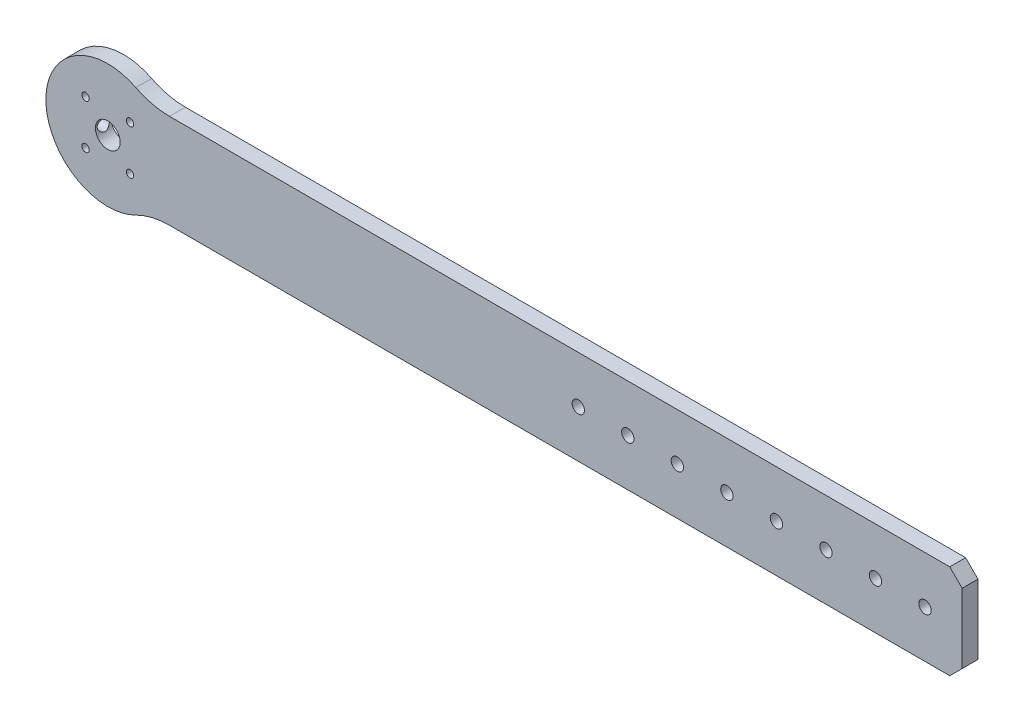
ISO-10303-21;
HEADER;
FILE_DESCRIPTION(('STEP AP214'),'2;1');
FILE_NAME('part.step','',(''),(''),'','','');
FILE_SCHEMA(('AUTOMOTIVE_DESIGN { 1 0 10303 214 1 1 1 1 }'));
ENDSEC;
DATA;
#1=APPLICATION_CONTEXT('core data for automotive mechanical design processes');
#2=APPLICATION_PROTOCOL_DEFINITION('international standard','automotive_design',2000,#1);
#3=PRODUCT_CONTEXT('',#1,'mechanical');
#4=PRODUCT('Part','Part','',(#3));
#5=PRODUCT_RELATED_PRODUCT_CATEGORY('part','',(#4));
#6=PRODUCT_DEFINITION_FORMATION('','',#4);
#7=PRODUCT_DEFINITION_CONTEXT('part definition',#1,'design');
#8=PRODUCT_DEFINITION('design','',#6,#7);
#9=PRODUCT_DEFINITION_SHAPE('','',#8);
#10=(LENGTH_UNIT() NAMED_UNIT(*) SI_UNIT(.MILLI.,.METRE.));
#11=(NAMED_UNIT(*) PLANE_ANGLE_UNIT() SI_UNIT($,.RADIAN.));
#12=(NAMED_UNIT(*) SI_UNIT($,.STERADIAN.) SOLID_ANGLE_UNIT());
#13=UNCERTAINTY_MEASURE_WITH_UNIT(LENGTH_MEASURE(1.E-05),#10,'distance_accuracy_value','');
#14=(GEOMETRIC_REPRESENTATION_CONTEXT(3) GLOBAL_UNCERTAINTY_ASSIGNED_CONTEXT((#13)) GLOBAL_UNIT_ASSIGNED_CONTEXT((#10,
#11,#12)) REPRESENTATION_CONTEXT('',''));
#15=CARTESIAN_POINT('',(0.,0.,0.));
#16=DIRECTION('',(0.,0.,1.));
#17=DIRECTION('',(1.,0.,0.));
#18=AXIS2_PLACEMENT_3D('',#15,#16,#17);
#19=CARTESIAN_POINT('',(0.,0.,3.2));
#20=DIRECTION('',(0.,0.,1.));
#21=DIRECTION('',(1.,0.,0.));
#22=AXIS2_PLACEMENT_3D('',#19,#20,#21);
#23=PLANE('',#22);
#24=CARTESIAN_POINT('',(210.,-8.37955521322352E-13,3.2));
#25=DIRECTION('',(0.,0.,1.));
#26=DIRECTION('',(1.,0.,0.));
#27=AXIS2_PLACEMENT_3D('',#24,#25,#26);
#28=CIRCLE('',#27,2.50000000000002);
#29=CARTESIAN_POINT('',(212.5,-8.37955521322352E-13,3.2));
#30=VERTEX_POINT('',#29);
#31=EDGE_CURVE('E438',#30,#30,#28,.T.);
#32=ORIENTED_EDGE('',*,*,#31,.F.);
#33=EDGE_LOOP('',(#32));
#34=FACE_BOUND('',#33,.T.);
#35=CARTESIAN_POINT('',(250.,-5.58637014214901E-13,3.2));
#36=DIRECTION('',(0.,0.,1.));
#37=DIRECTION('',(1.,0.,0.));
#38=AXIS2_PLACEMENT_3D('',#35,#36,#37);
#39=CIRCLE('',#38,2.50000000000002);
#40=CARTESIAN_POINT('',(252.5,-5.58637014214901E-13,3.2));
#41=VERTEX_POINT('',#40);
#42=EDGE_CURVE('E444',#41,#41,#39,.T.);
#43=ORIENTED_EDGE('',*,*,#42,.F.);
#44=EDGE_LOOP('',(#43));
#45=FACE_BOUND('',#44,.T.);
#46=CARTESIAN_POINT('',(290.,-2.79318507107451E-13,3.2));
#47=DIRECTION('',(0.,0.,1.));
#48=DIRECTION('',(1.,0.,0.));
#49=AXIS2_PLACEMENT_3D('',#46,#47,#48);
#50=CIRCLE('',#49,2.50000000000002);
#51=CARTESIAN_POINT('',(292.5,-2.79318507107451E-13,3.2));
#52=VERTEX_POINT('',#51);
#53=EDGE_CURVE('E356',#52,#52,#50,.T.);
#54=ORIENTED_EDGE('',*,*,#53,.F.);
#55=EDGE_LOOP('',(#54));
#56=FACE_BOUND('',#55,.T.);
#57=CARTESIAN_POINT('',(-8.98025612106908,8.98025612106923,3.2));
#58=DIRECTION('',(0.,0.,1.));
#59=DIRECTION('',(1.,0.,0.));
#60=AXIS2_PLACEMENT_3D('',#57,#58,#59);
#61=CIRCLE('',#60,1.5);
#62=CARTESIAN_POINT('',(-7.48025612106907,8.98025612106923,3.2));
#63=VERTEX_POINT('',#62);
#64=EDGE_CURVE('E371',#63,#63,#61,.T.);
#65=ORIENTED_EDGE('',*,*,#64,.F.);
#66=EDGE_LOOP('',(#65));
#67=FACE_BOUND('',#66,.T.);
#68=CARTESIAN_POINT('',(0.,0.,3.2));
#69=DIRECTION('',(0.,0.,1.));
#70=DIRECTION('',(1.,0.,0.));
#71=AXIS2_PLACEMENT_3D('',#68,#69,#70);
#72=CIRCLE('',#71,5.);
#73=CARTESIAN_POINT('',(5.,0.,3.2));
#74=VERTEX_POINT('',#73);
#75=EDGE_CURVE('E390',#74,#74,#72,.T.);
#76=ORIENTED_EDGE('',*,*,#75,.F.);
#77=EDGE_LOOP('',(#76));
#78=FACE_BOUND('',#77,.T.);
#79=CARTESIAN_POINT('',(8.98025612106914,-8.98025612106917,3.2));
#80=DIRECTION('',(0.,0.,1.));
#81=DIRECTION('',(1.,0.,0.));
#82=AXIS2_PLACEMENT_3D('',#79,#80,#81);
#83=CIRCLE('',#82,1.5);
#84=CARTESIAN_POINT('',(10.4802561210691,-8.98025612106917,3.2));
#85=VERTEX_POINT('',#84);
#86=EDGE_CURVE('E302',#85,#85,#83,.T.);
#87=ORIENTED_EDGE('',*,*,#86,.F.);
#88=EDGE_LOOP('',(#87));
#89=FACE_BOUND('',#88,.T.);
#90=DIRECTION('',(1.,0.,0.));
#91=VECTOR('',#90,1.);
#92=CARTESIAN_POINT('',(345.,-19.05,3.2));
#93=LINE('',#92,#91);
#94=CARTESIAN_POINT('',(24.8816699600328,-19.05,3.2));
#95=VERTEX_POINT('',#94);
#96=CARTESIAN_POINT('',(340.,-19.05,3.2));
#97=VERTEX_POINT('',#96);
#98=EDGE_CURVE('E138',#95,#97,#93,.T.);
#99=ORIENTED_EDGE('',*,*,#98,.T.);
#100=DIRECTION('',(-0.707106781186551,-0.707106781186544,0.));
#101=VECTOR('',#100,1.);
#102=CARTESIAN_POINT('',(179.524999999998,-179.525,3.2));
#103=LINE('',#102,#101);
#104=CARTESIAN_POINT('',(345.,-14.05,3.2));
#105=VERTEX_POINT('',#104);
#106=EDGE_CURVE('E62',#97,#105,#103,.F.);
#107=ORIENTED_EDGE('',*,*,#106,.T.);
#108=DIRECTION('',(0.,1.,0.));
#109=VECTOR('',#108,1.);
#110=CARTESIAN_POINT('',(345.,19.05,3.2));
#111=LINE('',#110,#109);
#112=CARTESIAN_POINT('',(345.,14.0499999999999,3.2));
#113=VERTEX_POINT('',#112);
#114=EDGE_CURVE('E147',#105,#113,#111,.T.);
#115=ORIENTED_EDGE('',*,*,#114,.T.);
#116=DIRECTION('',(0.707106781186551,-0.707106781186544,0.));
#117=VECTOR('',#116,1.);
#118=CARTESIAN_POINT('',(179.524999999998,179.525,3.2));
#119=LINE('',#118,#117);
#120=CARTESIAN_POINT('',(340.,19.05,3.2));
#121=VERTEX_POINT('',#120);
#122=EDGE_CURVE('E69',#113,#121,#119,.F.);
#123=ORIENTED_EDGE('',*,*,#122,.T.);
#124=DIRECTION('',(-1.,0.,0.));
#125=VECTOR('',#124,1.);
#126=CARTESIAN_POINT('',(345.,19.05,3.2));
#127=LINE('',#126,#125);
#128=CARTESIAN_POINT('',(24.8816699600328,19.05,3.2));
#129=VERTEX_POINT('',#128);
#130=EDGE_CURVE('E153',#121,#129,#127,.T.);
#131=ORIENTED_EDGE('',*,*,#130,.T.);
#132=CARTESIAN_POINT('',(24.8816699600328,49.05,3.2));
#133=DIRECTION('',(0.,0.,1.));
#134=DIRECTION('',(1.,0.,0.));
#135=AXIS2_PLACEMENT_3D('',#132,#133,#134);
#136=CIRCLE('',#135,30.);
#137=CARTESIAN_POINT('',(11.3098499818331,22.2954545454546,3.2));
#138=VERTEX_POINT('',#137);
#139=EDGE_CURVE('E173',#129,#138,#136,.F.);
#140=ORIENTED_EDGE('',*,*,#139,.T.);
#141=CARTESIAN_POINT('',(0.,0.,3.2));
#142=DIRECTION('',(0.,0.,1.));
#143=DIRECTION('',(1.,0.,0.));
#144=AXIS2_PLACEMENT_3D('',#141,#142,#143);
#145=CIRCLE('',#144,25.);
#146=CARTESIAN_POINT('',(11.3098499818331,-22.2954545454546,3.2));
#147=VERTEX_POINT('',#146);
#148=EDGE_CURVE('E331',#138,#147,#145,.T.);
#149=ORIENTED_EDGE('',*,*,#148,.T.);
#150=CARTESIAN_POINT('',(24.8816699600328,-49.05,3.2));
#151=DIRECTION('',(0.,0.,1.));
#152=DIRECTION('',(1.,0.,0.));
#153=AXIS2_PLACEMENT_3D('',#150,#151,#152);
#154=CIRCLE('',#153,30.);
#155=EDGE_CURVE('E133',#147,#95,#154,.F.);
#156=ORIENTED_EDGE('',*,*,#155,.T.);
#157=EDGE_LOOP('',(#99,#107,#115,#123,#131,#140,#149,#156));
#158=FACE_BOUND('',#157,.T.);
#159=CARTESIAN_POINT('',(8.98025612106914,8.98025612106917,3.2));
#160=DIRECTION('',(0.,0.,1.));
#161=DIRECTION('',(1.,0.,0.));
#162=AXIS2_PLACEMENT_3D('',#159,#160,#161);
#163=CIRCLE('',#162,1.5);
#164=CARTESIAN_POINT('',(10.4802561210691,8.98025612106917,3.2));
#165=VERTEX_POINT('',#164);
#166=EDGE_CURVE('E321',#165,#165,#163,.T.);
#167=ORIENTED_EDGE('',*,*,#166,.F.);
#168=EDGE_LOOP('',(#167));
#169=FACE_BOUND('',#168,.T.);
#170=CARTESIAN_POINT('',(-8.9802561210692,-8.98025612106911,3.2));
#171=DIRECTION('',(0.,0.,1.));
#172=DIRECTION('',(1.,0.,0.));
#173=AXIS2_PLACEMENT_3D('',#170,#171,#172);
#174=CIRCLE('',#173,1.5);
#175=CARTESIAN_POINT('',(-7.4802561210692,-8.98025612106911,3.2));
#176=VERTEX_POINT('',#175);
#177=EDGE_CURVE('E308',#176,#176,#174,.T.);
#178=ORIENTED_EDGE('',*,*,#177,.F.);
#179=EDGE_LOOP('',(#178));
#180=FACE_BOUND('',#179,.T.);
#181=CARTESIAN_POINT('',(330.,0.,3.2));
#182=DIRECTION('',(0.,0.,1.));
#183=DIRECTION('',(1.,0.,0.));
#184=AXIS2_PLACEMENT_3D('',#181,#182,#183);
#185=CIRCLE('',#184,2.50000000000002);
#186=CARTESIAN_POINT('',(332.5,0.,3.2));
#187=VERTEX_POINT('',#186);
#188=EDGE_CURVE('E382',#187,#187,#185,.T.);
#189=ORIENTED_EDGE('',*,*,#188,.F.);
#190=EDGE_LOOP('',(#189));
#191=FACE_BOUND('',#190,.T.);
#192=CARTESIAN_POINT('',(310.,-1.39659253553725E-13,3.2));
#193=DIRECTION('',(0.,0.,1.));
#194=DIRECTION('',(1.,0.,0.));
#195=AXIS2_PLACEMENT_3D('',#192,#193,#194);
#196=CIRCLE('',#195,2.50000000000002);
#197=CARTESIAN_POINT('',(312.5,-1.39659253553725E-13,3.2));
#198=VERTEX_POINT('',#197);
#199=EDGE_CURVE('E365',#198,#198,#196,.T.);
#200=ORIENTED_EDGE('',*,*,#199,.F.);
#201=EDGE_LOOP('',(#200));
#202=FACE_BOUND('',#201,.T.);
#203=CARTESIAN_POINT('',(270.,-4.18977760661176E-13,3.2));
#204=DIRECTION('',(0.,0.,1.));
#205=DIRECTION('',(1.,0.,0.));
#206=AXIS2_PLACEMENT_3D('',#203,#204,#205);
#207=CIRCLE('',#206,2.50000000000002);
#208=CARTESIAN_POINT('',(272.5,-4.18977760661176E-13,3.2));
#209=VERTEX_POINT('',#208);
#210=EDGE_CURVE('E357',#209,#209,#207,.T.);
#211=ORIENTED_EDGE('',*,*,#210,.F.);
#212=EDGE_LOOP('',(#211));
#213=FACE_BOUND('',#212,.T.);
#214=CARTESIAN_POINT('',(230.,-6.98296267768627E-13,3.2));
#215=DIRECTION('',(0.,0.,1.));
#216=DIRECTION('',(1.,0.,0.));
#217=AXIS2_PLACEMENT_3D('',#214,#215,#216);
#218=CIRCLE('',#217,2.50000000000002);
#219=CARTESIAN_POINT('',(232.5,-6.98296267768627E-13,3.2));
#220=VERTEX_POINT('',#219);
#221=EDGE_CURVE('E359',#220,#220,#218,.T.);
#222=ORIENTED_EDGE('',*,*,#221,.F.);
#223=EDGE_LOOP('',(#222));
#224=FACE_BOUND('',#223,.T.);
#225=CARTESIAN_POINT('',(190.,-9.77614774876077E-13,3.2));
#226=DIRECTION('',(0.,0.,1.));
#227=DIRECTION('',(1.,0.,0.));
#228=AXIS2_PLACEMENT_3D('',#225,#226,#227);
#229=CIRCLE('',#228,2.50000000000002);
#230=CARTESIAN_POINT('',(192.5,-9.77614774876077E-13,3.2));
#231=VERTEX_POINT('',#230);
#232=EDGE_CURVE('E430',#231,#231,#229,.T.);
#233=ORIENTED_EDGE('',*,*,#232,.F.);
#234=EDGE_LOOP('',(#233));
#235=FACE_BOUND('',#234,.T.);
#236=ADVANCED_FACE('F53',(#34,#45,#56,#67,#78,#89,#158,#169,#180,#191,#202,#213,#224,#235),#23,.T.);
#237=CARTESIAN_POINT('',(0.,0.,-3.2));
#238=DIRECTION('',(0.,0.,1.));
#239=DIRECTION('',(1.,0.,0.));
#240=AXIS2_PLACEMENT_3D('',#237,#238,#239);
#241=PLANE('',#240);
#242=DIRECTION('',(0.,1.,0.));
#243=VECTOR('',#242,1.);
#244=CARTESIAN_POINT('',(345.,19.05,-3.2));
#245=LINE('',#244,#243);
#246=CARTESIAN_POINT('',(345.,-14.05,-3.2));
#247=VERTEX_POINT('',#246);
#248=CARTESIAN_POINT('',(345.,14.0499999999999,-3.2));
#249=VERTEX_POINT('',#248);
#250=EDGE_CURVE('E325',#247,#249,#245,.T.);
#251=ORIENTED_EDGE('',*,*,#250,.F.);
#252=DIRECTION('',(0.707106781186551,0.707106781186544,0.));
#253=VECTOR('',#252,1.);
#254=CARTESIAN_POINT('',(345.,-14.0500000000001,-3.2));
#255=LINE('',#254,#253);
#256=CARTESIAN_POINT('',(340.,-19.05,-3.2));
#257=VERTEX_POINT('',#256);
#258=EDGE_CURVE('E145',#247,#257,#255,.F.);
#259=ORIENTED_EDGE('',*,*,#258,.T.);
#260=DIRECTION('',(1.,0.,0.));
#261=VECTOR('',#260,1.);
#262=CARTESIAN_POINT('',(345.,-19.05,-3.2));
#263=LINE('',#262,#261);
#264=CARTESIAN_POINT('',(24.8816699600328,-19.05,-3.2));
#265=VERTEX_POINT('',#264);
#266=EDGE_CURVE('E137',#265,#257,#263,.T.);
#267=ORIENTED_EDGE('',*,*,#266,.F.);
#268=CARTESIAN_POINT('',(24.8816699600328,-49.05,-3.2));
#269=DIRECTION('',(0.,0.,1.));
#270=DIRECTION('',(1.,0.,0.));
#271=AXIS2_PLACEMENT_3D('',#268,#269,#270);
#272=CIRCLE('',#271,30.);
#273=CARTESIAN_POINT('',(11.3098499818331,-22.2954545454546,-3.2));
#274=VERTEX_POINT('',#273);
#275=EDGE_CURVE('E122',#265,#274,#272,.T.);
#276=ORIENTED_EDGE('',*,*,#275,.T.);
#277=CARTESIAN_POINT('',(0.,0.,-3.2));
#278=DIRECTION('',(0.,0.,1.));
#279=DIRECTION('',(1.,0.,0.));
#280=AXIS2_PLACEMENT_3D('',#277,#278,#279);
#281=CIRCLE('',#280,25.);
#282=CARTESIAN_POINT('',(11.3098499818331,22.2954545454546,-3.2));
#283=VERTEX_POINT('',#282);
#284=EDGE_CURVE('E148',#283,#274,#281,.T.);
#285=ORIENTED_EDGE('',*,*,#284,.F.);
#286=CARTESIAN_POINT('',(24.8816699600328,49.05,-3.2));
#287=DIRECTION('',(0.,0.,1.));
#288=DIRECTION('',(1.,0.,0.));
#289=AXIS2_PLACEMENT_3D('',#286,#287,#288);
#290=CIRCLE('',#289,30.);
#291=CARTESIAN_POINT('',(24.8816699600328,19.05,-3.2));
#292=VERTEX_POINT('',#291);
#293=EDGE_CURVE('E170',#283,#292,#290,.T.);
#294=ORIENTED_EDGE('',*,*,#293,.T.);
#295=DIRECTION('',(-1.,0.,0.));
#296=VECTOR('',#295,1.);
#297=CARTESIAN_POINT('',(345.,19.05,-3.2));
#298=LINE('',#297,#296);
#299=CARTESIAN_POINT('',(340.,19.05,-3.2));
#300=VERTEX_POINT('',#299);
#301=EDGE_CURVE('E156',#300,#292,#298,.T.);
#302=ORIENTED_EDGE('',*,*,#301,.F.);
#303=DIRECTION('',(-0.707106781186551,0.707106781186544,0.));
#304=VECTOR('',#303,1.);
#305=CARTESIAN_POINT('',(340.,19.05,-3.2));
#306=LINE('',#305,#304);
#307=EDGE_CURVE('E183',#300,#249,#306,.F.);
#308=ORIENTED_EDGE('',*,*,#307,.T.);
#309=EDGE_LOOP('',(#251,#259,#267,#276,#285,#294,#302,#308));
#310=FACE_BOUND('',#309,.T.);
#311=CARTESIAN_POINT('',(8.98025612106914,8.98025612106917,-3.2));
#312=DIRECTION('',(0.,0.,1.));
#313=DIRECTION('',(1.,0.,0.));
#314=AXIS2_PLACEMENT_3D('',#311,#312,#313);
#315=CIRCLE('',#314,1.5);
#316=CARTESIAN_POINT('',(10.4802561210691,8.98025612106917,-3.2));
#317=VERTEX_POINT('',#316);
#318=EDGE_CURVE('E313',#317,#317,#315,.T.);
#319=ORIENTED_EDGE('',*,*,#318,.T.);
#320=EDGE_LOOP('',(#319));
#321=FACE_BOUND('',#320,.T.);
#322=CARTESIAN_POINT('',(8.98025612106914,-8.98025612106917,-3.2));
#323=DIRECTION('',(0.,0.,1.));
#324=DIRECTION('',(1.,0.,0.));
#325=AXIS2_PLACEMENT_3D('',#322,#323,#324);
#326=CIRCLE('',#325,1.5);
#327=CARTESIAN_POINT('',(10.4802561210691,-8.98025612106917,-3.2));
#328=VERTEX_POINT('',#327);
#329=EDGE_CURVE('E305',#328,#328,#326,.T.);
#330=ORIENTED_EDGE('',*,*,#329,.T.);
#331=EDGE_LOOP('',(#330));
#332=FACE_BOUND('',#331,.T.);
#333=CARTESIAN_POINT('',(-8.9802561210692,-8.98025612106911,-3.2));
#334=DIRECTION('',(0.,0.,1.));
#335=DIRECTION('',(1.,0.,0.));
#336=AXIS2_PLACEMENT_3D('',#333,#334,#335);
#337=CIRCLE('',#336,1.5);
#338=CARTESIAN_POINT('',(-7.4802561210692,-8.98025612106911,-3.2));
#339=VERTEX_POINT('',#338);
#340=EDGE_CURVE('E317',#339,#339,#337,.T.);
#341=ORIENTED_EDGE('',*,*,#340,.T.);
#342=EDGE_LOOP('',(#341));
#343=FACE_BOUND('',#342,.T.);
#344=CARTESIAN_POINT('',(0.,0.,-3.2));
#345=DIRECTION('',(0.,0.,1.));
#346=DIRECTION('',(1.,0.,0.));
#347=AXIS2_PLACEMENT_3D('',#344,#345,#346);
#348=CIRCLE('',#347,5.);
#349=CARTESIAN_POINT('',(5.,0.,-3.2));
#350=VERTEX_POINT('',#349);
#351=EDGE_CURVE('E386',#350,#350,#348,.T.);
#352=ORIENTED_EDGE('',*,*,#351,.T.);
#353=EDGE_LOOP('',(#352));
#354=FACE_BOUND('',#353,.T.);
#355=CARTESIAN_POINT('',(330.,0.,-3.2));
#356=DIRECTION('',(0.,0.,1.));
#357=DIRECTION('',(1.,0.,0.));
#358=AXIS2_PLACEMENT_3D('',#355,#356,#357);
#359=CIRCLE('',#358,2.50000000000002);
#360=CARTESIAN_POINT('',(332.5,0.,-3.2));
#361=VERTEX_POINT('',#360);
#362=EDGE_CURVE('E380',#361,#361,#359,.T.);
#363=ORIENTED_EDGE('',*,*,#362,.T.);
#364=EDGE_LOOP('',(#363));
#365=FACE_BOUND('',#364,.T.);
#366=CARTESIAN_POINT('',(-8.98025612106908,8.98025612106923,-3.2));
#367=DIRECTION('',(0.,0.,1.));
#368=DIRECTION('',(1.,0.,0.));
#369=AXIS2_PLACEMENT_3D('',#366,#367,#368);
#370=CIRCLE('',#369,1.5);
#371=CARTESIAN_POINT('',(-7.48025612106907,8.98025612106923,-3.2));
#372=VERTEX_POINT('',#371);
#373=EDGE_CURVE('E345',#372,#372,#370,.T.);
#374=ORIENTED_EDGE('',*,*,#373,.T.);
#375=EDGE_LOOP('',(#374));
#376=FACE_BOUND('',#375,.T.);
#377=CARTESIAN_POINT('',(310.,-1.39659253553725E-13,-3.2));
#378=DIRECTION('',(0.,0.,1.));
#379=DIRECTION('',(1.,0.,0.));
#380=AXIS2_PLACEMENT_3D('',#377,#378,#379);
#381=CIRCLE('',#380,2.50000000000002);
#382=CARTESIAN_POINT('',(312.5,-1.39659253553725E-13,-3.2));
#383=VERTEX_POINT('',#382);
#384=EDGE_CURVE('E367',#383,#383,#381,.T.);
#385=ORIENTED_EDGE('',*,*,#384,.T.);
#386=EDGE_LOOP('',(#385));
#387=FACE_BOUND('',#386,.T.);
#388=CARTESIAN_POINT('',(290.,-2.79318507107451E-13,-3.2));
#389=DIRECTION('',(0.,0.,1.));
#390=DIRECTION('',(1.,0.,0.));
#391=AXIS2_PLACEMENT_3D('',#388,#389,#390);
#392=CIRCLE('',#391,2.50000000000002);
#393=CARTESIAN_POINT('',(292.5,-2.79318507107451E-13,-3.2));
#394=VERTEX_POINT('',#393);
#395=EDGE_CURVE('E353',#394,#394,#392,.T.);
#396=ORIENTED_EDGE('',*,*,#395,.T.);
#397=EDGE_LOOP('',(#396));
#398=FACE_BOUND('',#397,.T.);
#399=CARTESIAN_POINT('',(270.,-4.18977760661176E-13,-3.2));
#400=DIRECTION('',(0.,0.,1.));
#401=DIRECTION('',(1.,0.,0.));
#402=AXIS2_PLACEMENT_3D('',#399,#400,#401);
#403=CIRCLE('',#402,2.50000000000002);
#404=CARTESIAN_POINT('',(272.5,-4.18977760661176E-13,-3.2));
#405=VERTEX_POINT('',#404);
#406=EDGE_CURVE('E415',#405,#405,#403,.T.);
#407=ORIENTED_EDGE('',*,*,#406,.T.);
#408=EDGE_LOOP('',(#407));
#409=FACE_BOUND('',#408,.T.);
#410=CARTESIAN_POINT('',(250.,-5.58637014214901E-13,-3.2));
#411=DIRECTION('',(0.,0.,1.));
#412=DIRECTION('',(1.,0.,0.));
#413=AXIS2_PLACEMENT_3D('',#410,#411,#412);
#414=CIRCLE('',#413,2.50000000000002);
#415=CARTESIAN_POINT('',(252.5,-5.58637014214901E-13,-3.2));
#416=VERTEX_POINT('',#415);
#417=EDGE_CURVE('E361',#416,#416,#414,.T.);
#418=ORIENTED_EDGE('',*,*,#417,.T.);
#419=EDGE_LOOP('',(#418));
#420=FACE_BOUND('',#419,.T.);
#421=CARTESIAN_POINT('',(230.,-6.98296267768627E-13,-3.2));
#422=DIRECTION('',(0.,0.,1.));
#423=DIRECTION('',(1.,0.,0.));
#424=AXIS2_PLACEMENT_3D('',#421,#422,#423);
#425=CIRCLE('',#424,2.50000000000002);
#426=CARTESIAN_POINT('',(232.5,-6.98296267768627E-13,-3.2));
#427=VERTEX_POINT('',#426);
#428=EDGE_CURVE('E362',#427,#427,#425,.T.);
#429=ORIENTED_EDGE('',*,*,#428,.T.);
#430=EDGE_LOOP('',(#429));
#431=FACE_BOUND('',#430,.T.);
#432=CARTESIAN_POINT('',(210.,-8.37955521322352E-13,-3.2));
#433=DIRECTION('',(0.,0.,1.));
#434=DIRECTION('',(1.,0.,0.));
#435=AXIS2_PLACEMENT_3D('',#432,#433,#434);
#436=CIRCLE('',#435,2.50000000000002);
#437=CARTESIAN_POINT('',(212.5,-8.37955521322352E-13,-3.2));
#438=VERTEX_POINT('',#437);
#439=EDGE_CURVE('E425',#438,#438,#436,.T.);
#440=ORIENTED_EDGE('',*,*,#439,.T.);
#441=EDGE_LOOP('',(#440));
#442=FACE_BOUND('',#441,.T.);
#443=CARTESIAN_POINT('',(190.,-9.77614774876077E-13,-3.2));
#444=DIRECTION('',(0.,0.,1.));
#445=DIRECTION('',(1.,0.,0.));
#446=AXIS2_PLACEMENT_3D('',#443,#444,#445);
#447=CIRCLE('',#446,2.50000000000002);
#448=CARTESIAN_POINT('',(192.5,-9.77614774876077E-13,-3.2));
#449=VERTEX_POINT('',#448);
#450=EDGE_CURVE('E428',#449,#449,#447,.T.);
#451=ORIENTED_EDGE('',*,*,#450,.T.);
#452=EDGE_LOOP('',(#451));
#453=FACE_BOUND('',#452,.T.);
#454=ADVANCED_FACE('F143',(#310,#321,#332,#343,#354,#365,#376,#387,#398,#409,#420,#431,#442,
#453),#241,.F.);
#455=CARTESIAN_POINT('',(345.,19.05,3.2));
#456=DIRECTION('',(-1.,0.,0.));
#457=DIRECTION('',(0.,0.,1.));
#458=AXIS2_PLACEMENT_3D('',#455,#456,#457);
#459=PLANE('',#458);
#460=ORIENTED_EDGE('',*,*,#114,.F.);
#461=DIRECTION('',(0.,0.,-1.));
#462=VECTOR('',#461,1.);
#463=CARTESIAN_POINT('',(345.,-14.0500000000001,3.2));
#464=LINE('',#463,#462);
#465=EDGE_CURVE('E179',#105,#247,#464,.T.);
#466=ORIENTED_EDGE('',*,*,#465,.T.);
#467=ORIENTED_EDGE('',*,*,#250,.T.);
#468=DIRECTION('',(0.,0.,1.));
#469=VECTOR('',#468,1.);
#470=CARTESIAN_POINT('',(345.,14.0499999999999,3.2));
#471=LINE('',#470,#469);
#472=EDGE_CURVE('E176',#249,#113,#471,.T.);
#473=ORIENTED_EDGE('',*,*,#472,.T.);
#474=EDGE_LOOP('',(#460,#466,#467,#473));
#475=FACE_BOUND('',#474,.T.);
#476=ADVANCED_FACE('F199',(#475),#459,.F.);
#477=CARTESIAN_POINT('',(345.,19.05,3.2));
#478=DIRECTION('',(0.,-1.,0.));
#479=DIRECTION('',(1.,0.,0.));
#480=AXIS2_PLACEMENT_3D('',#477,#478,#479);
#481=PLANE('',#480);
#482=ORIENTED_EDGE('',*,*,#130,.F.);
#483=DIRECTION('',(0.,0.,-1.));
#484=VECTOR('',#483,1.);
#485=CARTESIAN_POINT('',(340.,19.05,3.2));
#486=LINE('',#485,#484);
#487=EDGE_CURVE('E13',#121,#300,#486,.T.);
#488=ORIENTED_EDGE('',*,*,#487,.T.);
#489=ORIENTED_EDGE('',*,*,#301,.T.);
#490=DIRECTION('',(0.,0.,1.));
#491=VECTOR('',#490,1.);
#492=CARTESIAN_POINT('',(24.8816699600328,19.05,3.2));
#493=LINE('',#492,#491);
#494=EDGE_CURVE('E134',#292,#129,#493,.T.);
#495=ORIENTED_EDGE('',*,*,#494,.T.);
#496=EDGE_LOOP('',(#482,#488,#489,#495));
#497=FACE_BOUND('',#496,.T.);
#498=ADVANCED_FACE('F231',(#497),#481,.F.);
#499=CARTESIAN_POINT('',(0.,0.,3.2));
#500=DIRECTION('',(0.,0.,-1.));
#501=DIRECTION('',(-1.,0.,0.));
#502=AXIS2_PLACEMENT_3D('',#499,#500,#501);
#503=CYLINDRICAL_SURFACE('',#502,25.);
#504=CARTESIAN_POINT('',(-25.,0.,-2.5));
#505=CARTESIAN_POINT('',(-24.9999983880192,-0.140050884478893,-2.49999393524905));
#506=CARTESIAN_POINT('',(-24.9988106399051,-0.280194362919433,-2.48819182775889));
#507=CARTESIAN_POINT('',(-24.9941866898684,-0.556595996242093,-2.44128907427393));
#508=CARTESIAN_POINT('',(-24.9907480108506,-0.69284969792207,-2.40616275993853));
#509=CARTESIAN_POINT('',(-24.9820103640768,-0.957429188633536,-2.31364439850542));
#510=CARTESIAN_POINT('',(-24.9767125200177,-1.08575971153727,-2.25626579870381));
#511=CARTESIAN_POINT('',(-24.9648489348577,-1.33094040240102,-2.12089773017089));
#512=CARTESIAN_POINT('',(-24.9582834459533,-1.44779284694769,-2.04291235999965));
#513=CARTESIAN_POINT('',(-24.9445936085331,-1.6671488766852,-1.86824325584431));
#514=CARTESIAN_POINT('',(-24.9374675393466,-1.76960536208723,-1.77150050149492));
#515=CARTESIAN_POINT('',(-24.9234739226566,-1.95685630357746,-1.56218866434242));
#516=CARTESIAN_POINT('',(-24.9166063871229,-2.04164994270663,-1.44961884989403));
#517=CARTESIAN_POINT('',(-24.9038897888196,-2.19133492610904,-1.21155367079095));
#518=CARTESIAN_POINT('',(-24.8980429177726,-2.2561836636372,-1.08603138976285));
#519=CARTESIAN_POINT('',(-24.8880509386631,-2.3638659618569,-0.825811035237553));
#520=CARTESIAN_POINT('',(-24.8839057885556,-2.40670006647823,-0.691113188540125));
#521=CARTESIAN_POINT('',(-24.8778021018244,-2.46899760400473,-0.416845497834976));
#522=CARTESIAN_POINT('',(-24.8758362599524,-2.48853913250949,-0.277293557869479));
#523=CARTESIAN_POINT('',(-24.8742910765131,-2.5039382128384,0.00312215848945159));
#524=CARTESIAN_POINT('',(-24.8747116722186,-2.499796387177,0.143985900305148));
#525=CARTESIAN_POINT('',(-24.8778851724734,-2.4680107006317,0.422488274233296));
#526=CARTESIAN_POINT('',(-24.8806296147663,-2.44045211031138,0.560136748321736));
#527=CARTESIAN_POINT('',(-24.8881283571855,-2.36274786037647,0.828844908002736));
#528=CARTESIAN_POINT('',(-24.8928826844623,-2.31260189563937,0.959904504562578));
#529=CARTESIAN_POINT('',(-24.9038752363018,-2.19105223470377,1.21198396824722));
#530=CARTESIAN_POINT('',(-24.9101160977039,-2.11961070679995,1.33298547372329));
#531=CARTESIAN_POINT('',(-24.923376293322,-1.95752506838307,1.56131303727971));
#532=CARTESIAN_POINT('',(-24.9303956503196,-1.86688039584126,1.66863869495441));
#533=CARTESIAN_POINT('',(-24.9444596328247,-1.66848528103017,1.86706348497257));
#534=CARTESIAN_POINT('',(-24.9515042333249,-1.56066119712841,1.95808900470201));
#535=CARTESIAN_POINT('',(-24.964795726963,-1.33122370434278,2.12075908227597));
#536=CARTESIAN_POINT('',(-24.9710426192064,-1.209610279999,2.19240361839119));
#537=CARTESIAN_POINT('',(-24.9820368916774,-0.955995264230912,2.31427505077563));
#538=CARTESIAN_POINT('',(-24.9867840103692,-0.823991865974758,2.36449821204515));
#539=CARTESIAN_POINT('',(-24.9942411860352,-0.55336804332483,2.44204729177938));
#540=CARTESIAN_POINT('',(-24.9969513039266,-0.414747816941501,2.46937389497656));
#541=CARTESIAN_POINT('',(-25.0000212917078,-0.135462747729759,2.50026076933691));
#542=CARTESIAN_POINT('',(-25.0003912066934,0.00519075526373,2.50392262063125));
#543=CARTESIAN_POINT('',(-24.9987660439199,0.285109483289249,2.48764284237809));
#544=CARTESIAN_POINT('',(-24.9967709981117,0.424374727051175,2.4677015317118));
#545=CARTESIAN_POINT('',(-24.9906465384799,0.697270517086686,2.40486576144606));
#546=CARTESIAN_POINT('',(-24.986521547951,0.830912122430047,2.36201886380497));
#547=CARTESIAN_POINT('',(-24.9765999715152,1.08911080345945,2.25463706490682));
#548=CARTESIAN_POINT('',(-24.9708033481313,1.21366767539279,2.19010167740151));
#549=CARTESIAN_POINT('',(-24.9581618832606,1.45062045043036,2.04092290334022));
#550=CARTESIAN_POINT('',(-24.951313590086,1.56297414937229,1.95621277768546));
#551=CARTESIAN_POINT('',(-24.937348321738,1.77190405827969,1.76918483064768));
#552=CARTESIAN_POINT('',(-24.9302313398243,1.86847987212294,1.66686656732421));
#553=CARTESIAN_POINT('',(-24.9165006035189,2.04346527471786,1.4470835633525));
#554=CARTESIAN_POINT('',(-24.9098887534744,2.12180819669886,1.32956560864345));
#555=CARTESIAN_POINT('',(-24.8979458115222,2.25764564685957,1.08298159963329));
#556=CARTESIAN_POINT('',(-24.8926147021009,2.3151404601347,0.953915703279011));
#557=CARTESIAN_POINT('',(-24.8838486908512,2.40753802171119,0.688128151335515));
#558=CARTESIAN_POINT('',(-24.8804104612447,2.44248043702965,0.551420399772198));
#559=CARTESIAN_POINT('',(-24.8758091320719,2.48891001782366,0.27404200509807));
#560=CARTESIAN_POINT('',(-24.8746459672547,2.50039785599879,0.133371475760815));
#561=CARTESIAN_POINT('',(-24.8747278276891,2.49958284617814,-0.147276720891761));
#562=CARTESIAN_POINT('',(-24.8759622521752,2.48738472398278,-0.287254707207037));
#563=CARTESIAN_POINT('',(-24.8806775972386,2.43976363240913,-0.56316229292072));
#564=CARTESIAN_POINT('',(-24.884158520343,2.4043406369054,-0.699091887764949));
#565=CARTESIAN_POINT('',(-24.8929717065797,2.31130421574376,-0.963043372619642));
#566=CARTESIAN_POINT('',(-24.898303713509,2.25369386085229,-1.09106635407431));
#567=CARTESIAN_POINT('',(-24.910218795984,2.11792888727761,-1.33564222917759));
#568=CARTESIAN_POINT('',(-24.9168018645238,2.03977438363854,-1.45219518705157));
#569=CARTESIAN_POINT('',(-24.9305121802424,1.86474639071333,-1.67105918617984));
#570=CARTESIAN_POINT('',(-24.9376416181688,1.76779487222567,-1.77330769091771));
#571=CARTESIAN_POINT('',(-24.9516213682196,1.55807924806277,-1.96013058174914));
#572=CARTESIAN_POINT('',(-24.9584716130744,1.44531136027064,-2.04470072839292));
#573=CARTESIAN_POINT('',(-24.971139051729,1.20685358540322,-2.19393363463655));
#574=CARTESIAN_POINT('',(-24.9769536006703,1.08113187336691,-2.25854572736296));
#575=CARTESIAN_POINT('',(-24.9868657312474,0.820645697751377,-2.36565605705967));
#576=CARTESIAN_POINT('',(-24.9909652477413,0.685891624564023,-2.40817922738387));
#577=CARTESIAN_POINT('',(-24.9959553443433,0.458645653514261,-2.459301542712));
#578=CARTESIAN_POINT('',(-24.9974650172958,0.367606382111273,-2.47454261074839));
#579=CARTESIAN_POINT('',(-24.9994878737697,0.184391452043283,-2.4948938151544));
#580=CARTESIAN_POINT('',(-25.0000010614006,0.0922157980663948,-2.50000399330465));
#581=CARTESIAN_POINT('',(-25.,0.,-2.5));
#582=B_SPLINE_CURVE_WITH_KNOTS('',3,(#504,#505,#506,#507,#508,#509,#510,#511,#512,#513,#514,
#515,#516,#517,#518,#519,#520,#521,#522,#523,#524,#525,#526,#527,#528,#529,#530,#531,#532,#533,
#534,#535,#536,#537,#538,#539,#540,#541,#542,#543,#544,#545,#546,#547,#548,#549,#550,#551,#552,
#553,#554,#555,#556,#557,#558,#559,#560,#561,#562,#563,#564,#565,#566,#567,#568,#569,#570,#571,
#572,#573,#574,#575,#576,#577,#578,#579,#580,#581),.UNSPECIFIED.,.T.,.F.,(4,2,2,2,2,2,2,2,2,2,2,
2,2,2,2,2,2,2,2,2,2,2,2,2,2,2,2,2,2,2,2,2,2,2,2,2,2,2,4),(0.,0.419815915671184,
0.840094607088716,1.26011971433051,1.68006134395696,2.10134642155736,2.52265098051765,
2.94484938680554,3.3670373610626,3.78780580112991,4.20856318139441,4.62779493602776,
5.04703235404084,5.46701903432236,5.88701800827813,6.30886835490516,6.73071917449429,
7.15264351733954,7.57455524188599,7.99465471519394,8.41474851297859,8.83397338235762,
9.25320765123667,9.67384851871746,10.0944999452557,10.516666090215,10.9388264618844,
11.3602422648251,11.7816459809896,12.2011907323489,12.620735955651,13.04022313407,
13.459707963474,13.8809729356913,14.3023388159239,14.7247657756561,15.1467148698824,
15.4231416808087,15.6995673517257),.UNSPECIFIED.);
#583=CARTESIAN_POINT('',(-25.,0.,-2.5));
#584=VERTEX_POINT('',#583);
#585=EDGE_CURVE('E351',#584,#584,#582,.T.);
#586=ORIENTED_EDGE('',*,*,#585,.F.);
#587=EDGE_LOOP('',(#586));
#588=FACE_BOUND('',#587,.T.);
#589=ORIENTED_EDGE('',*,*,#284,.T.);
#590=DIRECTION('',(0.,0.,-1.));
#591=VECTOR('',#590,1.);
#592=CARTESIAN_POINT('',(11.3098499818331,-22.2954545454546,3.2));
#593=LINE('',#592,#591);
#594=EDGE_CURVE('E127',#274,#147,#593,.F.);
#595=ORIENTED_EDGE('',*,*,#594,.T.);
#596=ORIENTED_EDGE('',*,*,#148,.F.);
#597=DIRECTION('',(0.,0.,-1.));
#598=VECTOR('',#597,1.);
#599=CARTESIAN_POINT('',(11.3098499818331,22.2954545454546,3.2));
#600=LINE('',#599,#598);
#601=EDGE_CURVE('E140',#138,#283,#600,.T.);
#602=ORIENTED_EDGE('',*,*,#601,.T.);
#603=EDGE_LOOP('',(#589,#595,#596,#602));
#604=FACE_BOUND('',#603,.T.);
#605=ADVANCED_FACE('F228',(#588,#604),#503,.T.);
#606=CARTESIAN_POINT('',(345.,-19.05,3.2));
#607=DIRECTION('',(0.,1.,0.));
#608=DIRECTION('',(-1.,0.,0.));
#609=AXIS2_PLACEMENT_3D('',#606,#607,#608);
#610=PLANE('',#609);
#611=ORIENTED_EDGE('',*,*,#266,.T.);
#612=DIRECTION('',(0.,0.,1.));
#613=VECTOR('',#612,1.);
#614=CARTESIAN_POINT('',(340.,-19.05,3.2));
#615=LINE('',#614,#613);
#616=EDGE_CURVE('E77',#257,#97,#615,.T.);
#617=ORIENTED_EDGE('',*,*,#616,.T.);
#618=ORIENTED_EDGE('',*,*,#98,.F.);
#619=DIRECTION('',(0.,0.,1.));
#620=VECTOR('',#619,1.);
#621=CARTESIAN_POINT('',(24.8816699600328,-19.05,-3.2));
#622=LINE('',#621,#620);
#623=EDGE_CURVE('E126',#95,#265,#622,.F.);
#624=ORIENTED_EDGE('',*,*,#623,.T.);
#625=EDGE_LOOP('',(#611,#617,#618,#624));
#626=FACE_BOUND('',#625,.T.);
#627=ADVANCED_FACE('F136',(#626),#610,.F.);
#628=CARTESIAN_POINT('',(8.98025612106914,8.98025612106917,3.2));
#629=DIRECTION('',(0.,0.,-1.));
#630=DIRECTION('',(-1.,0.,0.));
#631=AXIS2_PLACEMENT_3D('',#628,#629,#630);
#632=CYLINDRICAL_SURFACE('',#631,1.5);
#633=ORIENTED_EDGE('',*,*,#166,.T.);
#634=EDGE_LOOP('',(#633));
#635=FACE_BOUND('',#634,.T.);
#636=ORIENTED_EDGE('',*,*,#318,.F.);
#637=EDGE_LOOP('',(#636));
#638=FACE_BOUND('',#637,.T.);
#639=ADVANCED_FACE('F223',(#635,#638),#632,.F.);
#640=CARTESIAN_POINT('',(8.98025612106914,-8.98025612106917,3.2));
#641=DIRECTION('',(0.,0.,-1.));
#642=DIRECTION('',(-1.,0.,0.));
#643=AXIS2_PLACEMENT_3D('',#640,#641,#642);
#644=CYLINDRICAL_SURFACE('',#643,1.5);
#645=ORIENTED_EDGE('',*,*,#86,.T.);
#646=EDGE_LOOP('',(#645));
#647=FACE_BOUND('',#646,.T.);
#648=ORIENTED_EDGE('',*,*,#329,.F.);
#649=EDGE_LOOP('',(#648));
#650=FACE_BOUND('',#649,.T.);
#651=ADVANCED_FACE('F291',(#647,#650),#644,.F.);
#652=CARTESIAN_POINT('',(-8.9802561210692,-8.98025612106911,3.2));
#653=DIRECTION('',(0.,0.,-1.));
#654=DIRECTION('',(-1.,0.,0.));
#655=AXIS2_PLACEMENT_3D('',#652,#653,#654);
#656=CYLINDRICAL_SURFACE('',#655,1.5);
#657=ORIENTED_EDGE('',*,*,#177,.T.);
#658=EDGE_LOOP('',(#657));
#659=FACE_BOUND('',#658,.T.);
#660=ORIENTED_EDGE('',*,*,#340,.F.);
#661=EDGE_LOOP('',(#660));
#662=FACE_BOUND('',#661,.T.);
#663=ADVANCED_FACE('F288',(#659,#662),#656,.F.);
#664=CARTESIAN_POINT('',(0.,0.,3.2));
#665=DIRECTION('',(0.,0.,-1.));
#666=DIRECTION('',(-1.,0.,0.));
#667=AXIS2_PLACEMENT_3D('',#664,#665,#666);
#668=CYLINDRICAL_SURFACE('',#667,5.);
#669=CARTESIAN_POINT('',(-5.,0.,-2.5));
#670=CARTESIAN_POINT('',(-4.99999177550472,-0.131426682334305,-2.49999033094399));
#671=CARTESIAN_POINT('',(-4.99476199135277,-0.263015634437213,-2.48957443822597));
#672=CARTESIAN_POINT('',(-4.9743541856102,-0.522301454622883,-2.44836817883795));
#673=CARTESIAN_POINT('',(-4.9591572718767,-0.649990448564105,-2.41753911907498));
#674=CARTESIAN_POINT('',(-4.92040690922477,-0.897333631316203,-2.33701537728116));
#675=CARTESIAN_POINT('',(-4.89688595907259,-1.01701694536277,-2.28739401221727));
#676=CARTESIAN_POINT('',(-4.84364443325827,-1.24618160399671,-2.1710734737482));
#677=CARTESIAN_POINT('',(-4.81392434644421,-1.3556637520377,-2.10437564685491));
#678=CARTESIAN_POINT('',(-4.74890645050632,-1.56876952630998,-1.95120686835737));
#679=CARTESIAN_POINT('',(-4.71337997659091,-1.67163802294308,-1.86378379977022));
#680=CARTESIAN_POINT('',(-4.64149925776731,-1.86194861703333,-1.67369630401471));
#681=CARTESIAN_POINT('',(-4.60514440566897,-1.94937895911555,-1.57102037115989));
#682=CARTESIAN_POINT('',(-4.53247377945622,-2.11312999967247,-1.34379162555472));
#683=CARTESIAN_POINT('',(-4.49637967412567,-2.18806333849064,-1.21815975396499));
#684=CARTESIAN_POINT('',(-4.43214946943555,-2.31542056761491,-0.954081660204565));
#685=CARTESIAN_POINT('',(-4.40400769020792,-2.36786053751682,-0.815644678237381));
#686=CARTESIAN_POINT('',(-4.36144667591402,-2.44533110537653,-0.538337236403587));
#687=CARTESIAN_POINT('',(-4.34630678958452,-2.47181464267578,-0.399988869820418));
#688=CARTESIAN_POINT('',(-4.3295472487215,-2.50106748329741,-0.120052905562392));
#689=CARTESIAN_POINT('',(-4.3279142335843,-2.50386022093906,0.0215313521750936));
#690=CARTESIAN_POINT('',(-4.33777325642937,-2.48671821792512,0.285715060790882));
#691=CARTESIAN_POINT('',(-4.34771909154984,-2.46946139884055,0.408560078058287));
#692=CARTESIAN_POINT('',(-4.37690571834675,-2.41734962264384,0.649304773431946));
#693=CARTESIAN_POINT('',(-4.39614947079454,-2.38248905974454,0.767202863263112));
#694=CARTESIAN_POINT('',(-4.44218691031839,-2.29552445096459,0.998072831414332));
#695=CARTESIAN_POINT('',(-4.46914601659993,-2.24303766778987,1.11086599696452));
#696=CARTESIAN_POINT('',(-4.52758510703513,-2.12260421917012,1.32658573147497));
#697=CARTESIAN_POINT('',(-4.55906711950478,-2.0546506095312,1.42950783900021));
#698=CARTESIAN_POINT('',(-4.62782894758213,-1.89516513728193,1.63630313185808));
#699=CARTESIAN_POINT('',(-4.66533775591865,-1.80173614592319,1.7386421839404));
#700=CARTESIAN_POINT('',(-4.73869058251019,-1.59888894685344,1.92683854647725));
#701=CARTESIAN_POINT('',(-4.77453379897003,-1.48946314143571,2.01268798008471));
#702=CARTESIAN_POINT('',(-4.84254968207409,-1.25129126457962,2.16921415257432));
#703=CARTESIAN_POINT('',(-4.87447460405015,-1.12188397899853,2.23900118111436));
#704=CARTESIAN_POINT('',(-4.92894702803109,-0.851165538721983,2.35524257260752));
#705=CARTESIAN_POINT('',(-4.95150197358893,-0.709863940663161,2.4017154625379));
#706=CARTESIAN_POINT('',(-4.98310834353579,-0.431916229151779,2.4661885092917));
#707=CARTESIAN_POINT('',(-4.9931234575324,-0.295853826370905,2.486228089367));
#708=CARTESIAN_POINT('',(-5.00182533647794,-0.0219489998732872,2.50366182783617));
#709=CARTESIAN_POINT('',(-5.00051746803426,0.11589254967511,2.5010667140985));
#710=CARTESIAN_POINT('',(-4.98727980633468,0.378082429964657,2.4744832789533));
#711=CARTESIAN_POINT('',(-4.97618114219992,0.502648520123707,2.45216866817559));
#712=CARTESIAN_POINT('',(-4.94555428287529,0.746017230755973,2.38940482026162));
#713=CARTESIAN_POINT('',(-4.92602515837625,0.864819214231884,2.3489535838641));
#714=CARTESIAN_POINT('',(-4.87960628532329,1.09722152111965,2.25000383391964));
#715=CARTESIAN_POINT('',(-4.85252204417873,1.21057599249831,2.19102237471768));
#716=CARTESIAN_POINT('',(-4.7935993579975,1.42615340426439,2.05723116087518));
#717=CARTESIAN_POINT('',(-4.76175888940534,1.52837157450204,1.98241466348011));
#718=CARTESIAN_POINT('',(-4.69270553315087,1.72941922315487,1.81059893670911));
#719=CARTESIAN_POINT('',(-4.65527212009488,1.82693019428496,1.7121428290248));
#720=CARTESIAN_POINT('',(-4.58155978921587,2.0046408025722,1.50018712195056));
#721=CARTESIAN_POINT('',(-4.54528168472407,2.08482846428685,1.38667720293013));
#722=CARTESIAN_POINT('',(-4.4762798054528,2.22926978618995,1.14089086451535));
#723=CARTESIAN_POINT('',(-4.44381323981254,2.29256373922243,1.00797183470886));
#724=CARTESIAN_POINT('',(-4.38935180726746,2.39520706511459,0.731224831117447));
#725=CARTESIAN_POINT('',(-4.36734345549014,2.43458729077055,0.587411184000008));
#726=CARTESIAN_POINT('',(-4.33903752569351,2.48465421767005,0.307724442637056));
#727=CARTESIAN_POINT('',(-4.33143458674096,2.4977324874436,0.172414365881029));
#728=CARTESIAN_POINT('',(-4.32913386592579,2.50172288950898,-0.0986176673806806));
#729=CARTESIAN_POINT('',(-4.33443049025111,2.49264462983266,-0.23433941987363));
#730=CARTESIAN_POINT('',(-4.35594655164663,2.45481530197332,-0.48870875561685));
#731=CARTESIAN_POINT('',(-4.37107736338133,2.42802074302696,-0.607751181720765));
#732=CARTESIAN_POINT('',(-4.40927540337602,2.35793843840544,-0.839520292199955));
#733=CARTESIAN_POINT('',(-4.43234518434965,2.31464538728732,-0.952244931566542));
#734=CARTESIAN_POINT('',(-4.48571326433413,2.20953919315538,-1.17656215271973));
#735=CARTESIAN_POINT('',(-4.5163930799845,2.14667719009403,-1.28756985173502));
#736=CARTESIAN_POINT('',(-4.58088327077455,2.0053780838799,-1.49818624324005));
#737=CARTESIAN_POINT('',(-4.61469526970767,1.92693287765888,-1.59778896262873));
#738=CARTESIAN_POINT('',(-4.68655816327011,1.74550556946065,-1.79535536374964));
#739=CARTESIAN_POINT('',(-4.72462491514981,1.64070022469209,-1.89164936417138));
#740=CARTESIAN_POINT('',(-4.79694347383545,1.41539785420684,-2.06565584942804));
#741=CARTESIAN_POINT('',(-4.83119321905446,1.29489242426332,-2.14335831860588));
#742=CARTESIAN_POINT('',(-4.89245149457782,1.03978808878536,-2.2780969794841));
#743=CARTESIAN_POINT('',(-4.91940711437488,0.905095560782286,-2.33498316778445));
#744=CARTESIAN_POINT('',(-4.95177960923351,0.69632870925735,-2.4021838587924));
#745=CARTESIAN_POINT('',(-4.96122314081874,0.625670413494086,-2.42155539800181));
#746=CARTESIAN_POINT('',(-4.97717127275101,0.482623997839256,-2.4540659483706));
#747=CARTESIAN_POINT('',(-4.98367766823159,0.410236963092399,-2.46720876667635));
#748=CARTESIAN_POINT('',(-4.9923820076613,0.281518684621669,-2.48473747228463));
#749=CARTESIAN_POINT('',(-4.99523288466454,0.225408499555443,-2.49045493653132));
#750=CARTESIAN_POINT('',(-4.99904367329659,0.112875528456288,-2.49808832946571));
#751=CARTESIAN_POINT('',(-5.00000353273198,0.0564527338382176,-2.50000415322548));
#752=CARTESIAN_POINT('',(-5.,0.,-2.5));
#753=B_SPLINE_CURVE_WITH_KNOTS('',3,(#669,#670,#671,#672,#673,#674,#675,#676,#677,#678,#679,
#680,#681,#682,#683,#684,#685,#686,#687,#688,#689,#690,#691,#692,#693,#694,#695,#696,#697,#698,
#699,#700,#701,#702,#703,#704,#705,#706,#707,#708,#709,#710,#711,#712,#713,#714,#715,#716,#717,
#718,#719,#720,#721,#722,#723,#724,#725,#726,#727,#728,#729,#730,#731,#732,#733,#734,#735,#736,
#737,#738,#739,#740,#741,#742,#743,#744,#745,#746,#747,#748,#749,#750,#751,#752),.UNSPECIFIED.,
.T.,.F.,(4,2,2,2,2,2,2,2,2,2,2,2,2,2,2,2,2,2,2,2,2,2,2,2,2,2,2,2,2,2,2,2,2,2,2,2,2,2,2,2,2,4),
(0.,0.394060643550731,0.788870374272994,1.18215538873075,1.57540940145392,1.99245439679522,
2.40981559413509,2.85954316076882,3.30894869745702,3.73145030350574,4.15353393322551,
4.52514281023301,4.89687009814196,5.27725600421218,5.65781303150554,6.08662353334696,
6.51563836496716,6.96457555536102,7.41315542280699,7.82458226178364,8.2358141127869,
8.61517266265305,8.99457304077329,9.38482140069747,9.77523626870848,10.2039902661037,
10.6330397153795,11.0828670540368,11.53211279863,11.9382326875699,12.3441764966107,
12.7114482562151,13.0788382197025,13.4709114195009,13.8631890285845,14.303131068923,
14.7433095845248,15.1866003415819,15.407934939208,15.6291340766843,15.7983933645035,
15.9676573239323),.UNSPECIFIED.);
#754=CARTESIAN_POINT('',(-5.,0.,-2.5));
#755=VERTEX_POINT('',#754);
#756=EDGE_CURVE('E348',#755,#755,#753,.T.);
#757=ORIENTED_EDGE('',*,*,#756,.T.);
#758=EDGE_LOOP('',(#757));
#759=FACE_BOUND('',#758,.T.);
#760=ORIENTED_EDGE('',*,*,#75,.T.);
#761=EDGE_LOOP('',(#760));
#762=FACE_BOUND('',#761,.T.);
#763=ORIENTED_EDGE('',*,*,#351,.F.);
#764=EDGE_LOOP('',(#763));
#765=FACE_BOUND('',#764,.T.);
#766=ADVANCED_FACE('F284',(#759,#762,#765),#668,.F.);
#767=CARTESIAN_POINT('',(330.,0.,3.2));
#768=DIRECTION('',(0.,0.,-1.));
#769=DIRECTION('',(-1.,0.,0.));
#770=AXIS2_PLACEMENT_3D('',#767,#768,#769);
#771=CYLINDRICAL_SURFACE('',#770,2.50000000000002);
#772=ORIENTED_EDGE('',*,*,#188,.T.);
#773=EDGE_LOOP('',(#772));
#774=FACE_BOUND('',#773,.T.);
#775=ORIENTED_EDGE('',*,*,#362,.F.);
#776=EDGE_LOOP('',(#775));
#777=FACE_BOUND('',#776,.T.);
#778=ADVANCED_FACE('F280',(#774,#777),#771,.F.);
#779=CARTESIAN_POINT('',(-8.98025612106908,8.98025612106923,3.2));
#780=DIRECTION('',(0.,0.,-1.));
#781=DIRECTION('',(-1.,0.,0.));
#782=AXIS2_PLACEMENT_3D('',#779,#780,#781);
#783=CYLINDRICAL_SURFACE('',#782,1.5);
#784=ORIENTED_EDGE('',*,*,#64,.T.);
#785=EDGE_LOOP('',(#784));
#786=FACE_BOUND('',#785,.T.);
#787=ORIENTED_EDGE('',*,*,#373,.F.);
#788=EDGE_LOOP('',(#787));
#789=FACE_BOUND('',#788,.T.);
#790=ADVANCED_FACE('F276',(#786,#789),#783,.F.);
#791=CARTESIAN_POINT('',(310.,-1.39659253553725E-13,3.2));
#792=DIRECTION('',(0.,0.,-1.));
#793=DIRECTION('',(-1.,0.,0.));
#794=AXIS2_PLACEMENT_3D('',#791,#792,#793);
#795=CYLINDRICAL_SURFACE('',#794,2.50000000000002);
#796=ORIENTED_EDGE('',*,*,#199,.T.);
#797=EDGE_LOOP('',(#796));
#798=FACE_BOUND('',#797,.T.);
#799=ORIENTED_EDGE('',*,*,#384,.F.);
#800=EDGE_LOOP('',(#799));
#801=FACE_BOUND('',#800,.T.);
#802=ADVANCED_FACE('F272',(#798,#801),#795,.F.);
#803=CARTESIAN_POINT('',(290.,-2.79318507107451E-13,3.2));
#804=DIRECTION('',(0.,0.,-1.));
#805=DIRECTION('',(-1.,0.,0.));
#806=AXIS2_PLACEMENT_3D('',#803,#804,#805);
#807=CYLINDRICAL_SURFACE('',#806,2.50000000000002);
#808=ORIENTED_EDGE('',*,*,#53,.T.);
#809=EDGE_LOOP('',(#808));
#810=FACE_BOUND('',#809,.T.);
#811=ORIENTED_EDGE('',*,*,#395,.F.);
#812=EDGE_LOOP('',(#811));
#813=FACE_BOUND('',#812,.T.);
#814=ADVANCED_FACE('F268',(#810,#813),#807,.F.);
#815=CARTESIAN_POINT('',(270.,-4.18977760661176E-13,3.2));
#816=DIRECTION('',(0.,0.,-1.));
#817=DIRECTION('',(-1.,0.,0.));
#818=AXIS2_PLACEMENT_3D('',#815,#816,#817);
#819=CYLINDRICAL_SURFACE('',#818,2.50000000000002);
#820=ORIENTED_EDGE('',*,*,#210,.T.);
#821=EDGE_LOOP('',(#820));
#822=FACE_BOUND('',#821,.T.);
#823=ORIENTED_EDGE('',*,*,#406,.F.);
#824=EDGE_LOOP('',(#823));
#825=FACE_BOUND('',#824,.T.);
#826=ADVANCED_FACE('F264',(#822,#825),#819,.F.);
#827=CARTESIAN_POINT('',(250.,-5.58637014214901E-13,3.2));
#828=DIRECTION('',(0.,0.,-1.));
#829=DIRECTION('',(-1.,0.,0.));
#830=AXIS2_PLACEMENT_3D('',#827,#828,#829);
#831=CYLINDRICAL_SURFACE('',#830,2.50000000000002);
#832=ORIENTED_EDGE('',*,*,#42,.T.);
#833=EDGE_LOOP('',(#832));
#834=FACE_BOUND('',#833,.T.);
#835=ORIENTED_EDGE('',*,*,#417,.F.);
#836=EDGE_LOOP('',(#835));
#837=FACE_BOUND('',#836,.T.);
#838=ADVANCED_FACE('F260',(#834,#837),#831,.F.);
#839=CARTESIAN_POINT('',(230.,-6.98296267768627E-13,3.2));
#840=DIRECTION('',(0.,0.,-1.));
#841=DIRECTION('',(-1.,0.,0.));
#842=AXIS2_PLACEMENT_3D('',#839,#840,#841);
#843=CYLINDRICAL_SURFACE('',#842,2.50000000000002);
#844=ORIENTED_EDGE('',*,*,#221,.T.);
#845=EDGE_LOOP('',(#844));
#846=FACE_BOUND('',#845,.T.);
#847=ORIENTED_EDGE('',*,*,#428,.F.);
#848=EDGE_LOOP('',(#847));
#849=FACE_BOUND('',#848,.T.);
#850=ADVANCED_FACE('F249',(#846,#849),#843,.F.);
#851=CARTESIAN_POINT('',(210.,-8.37955521322352E-13,3.2));
#852=DIRECTION('',(0.,0.,-1.));
#853=DIRECTION('',(-1.,0.,0.));
#854=AXIS2_PLACEMENT_3D('',#851,#852,#853);
#855=CYLINDRICAL_SURFACE('',#854,2.50000000000002);
#856=ORIENTED_EDGE('',*,*,#31,.T.);
#857=EDGE_LOOP('',(#856));
#858=FACE_BOUND('',#857,.T.);
#859=ORIENTED_EDGE('',*,*,#439,.F.);
#860=EDGE_LOOP('',(#859));
#861=FACE_BOUND('',#860,.T.);
#862=ADVANCED_FACE('F243',(#858,#861),#855,.F.);
#863=CARTESIAN_POINT('',(190.,-9.77614774876077E-13,3.2));
#864=DIRECTION('',(0.,0.,-1.));
#865=DIRECTION('',(-1.,0.,0.));
#866=AXIS2_PLACEMENT_3D('',#863,#864,#865);
#867=CYLINDRICAL_SURFACE('',#866,2.50000000000002);
#868=ORIENTED_EDGE('',*,*,#232,.T.);
#869=EDGE_LOOP('',(#868));
#870=FACE_BOUND('',#869,.T.);
#871=ORIENTED_EDGE('',*,*,#450,.F.);
#872=EDGE_LOOP('',(#871));
#873=FACE_BOUND('',#872,.T.);
#874=ADVANCED_FACE('F239',(#870,#873),#867,.F.);
#875=CARTESIAN_POINT('',(24.8816699600328,-49.05,3.2));
#876=DIRECTION('',(0.,0.,-1.));
#877=DIRECTION('',(-1.,0.,0.));
#878=AXIS2_PLACEMENT_3D('',#875,#876,#877);
#879=CYLINDRICAL_SURFACE('',#878,30.);
#880=ORIENTED_EDGE('',*,*,#155,.F.);
#881=ORIENTED_EDGE('',*,*,#594,.F.);
#882=ORIENTED_EDGE('',*,*,#275,.F.);
#883=ORIENTED_EDGE('',*,*,#623,.F.);
#884=EDGE_LOOP('',(#880,#881,#882,#883));
#885=FACE_BOUND('',#884,.T.);
#886=ADVANCED_FACE('F125',(#885),#879,.F.);
#887=CARTESIAN_POINT('',(24.8816699600328,49.05,3.2));
#888=DIRECTION('',(0.,0.,-1.));
#889=DIRECTION('',(-1.,0.,0.));
#890=AXIS2_PLACEMENT_3D('',#887,#888,#889);
#891=CYLINDRICAL_SURFACE('',#890,30.);
#892=ORIENTED_EDGE('',*,*,#139,.F.);
#893=ORIENTED_EDGE('',*,*,#494,.F.);
#894=ORIENTED_EDGE('',*,*,#293,.F.);
#895=ORIENTED_EDGE('',*,*,#601,.F.);
#896=EDGE_LOOP('',(#892,#893,#894,#895));
#897=FACE_BOUND('',#896,.T.);
#898=ADVANCED_FACE('F204',(#897),#891,.F.);
#899=CARTESIAN_POINT('',(345.,-14.0500000000001,3.2));
#900=DIRECTION('',(-0.707106781186544,0.707106781186551,0.));
#901=DIRECTION('',(0.,0.,-1.));
#902=AXIS2_PLACEMENT_3D('',#899,#900,#901);
#903=PLANE('',#902);
#904=ORIENTED_EDGE('',*,*,#106,.F.);
#905=ORIENTED_EDGE('',*,*,#616,.F.);
#906=ORIENTED_EDGE('',*,*,#258,.F.);
#907=ORIENTED_EDGE('',*,*,#465,.F.);
#908=EDGE_LOOP('',(#904,#905,#906,#907));
#909=FACE_BOUND('',#908,.T.);
#910=ADVANCED_FACE('F202',(#909),#903,.F.);
#911=CARTESIAN_POINT('',(340.,19.05,3.2));
#912=DIRECTION('',(-0.707106781186544,-0.707106781186551,0.));
#913=DIRECTION('',(0.,0.,-1.));
#914=AXIS2_PLACEMENT_3D('',#911,#912,#913);
#915=PLANE('',#914);
#916=ORIENTED_EDGE('',*,*,#122,.F.);
#917=ORIENTED_EDGE('',*,*,#472,.F.);
#918=ORIENTED_EDGE('',*,*,#307,.F.);
#919=ORIENTED_EDGE('',*,*,#487,.F.);
#920=EDGE_LOOP('',(#916,#917,#918,#919));
#921=FACE_BOUND('',#920,.T.);
#922=ADVANCED_FACE('F55',(#921),#915,.F.);
#923=CARTESIAN_POINT('',(-25.001,0.,0.));
#924=DIRECTION('',(1.,0.,0.));
#925=DIRECTION('',(0.,0.,-1.));
#926=AXIS2_PLACEMENT_3D('',#923,#924,#925);
#927=CYLINDRICAL_SURFACE('',#926,2.5);
#928=ORIENTED_EDGE('',*,*,#756,.F.);
#929=EDGE_LOOP('',(#928));
#930=FACE_BOUND('',#929,.T.);
#931=ORIENTED_EDGE('',*,*,#585,.T.);
#932=EDGE_LOOP('',(#931));
#933=FACE_BOUND('',#932,.T.);
#934=ADVANCED_FACE('F209',(#930,#933),#927,.F.);
#935=CLOSED_SHELL('',(#236,#454,#476,#498,#605,#627,#639,#651,#663,#766,#778,#790,#802,#814,
#826,#838,#850,#862,#874,#886,#898,#910,#922,#934));
#936=MANIFOLD_SOLID_BREP('B2',#935);
#937=ADVANCED_BREP_SHAPE_REPRESENTATION('',(#18,#936),#14);
#938=SHAPE_DEFINITION_REPRESENTATION(#9,#937);
ENDSEC;
END-ISO-10303-21;
